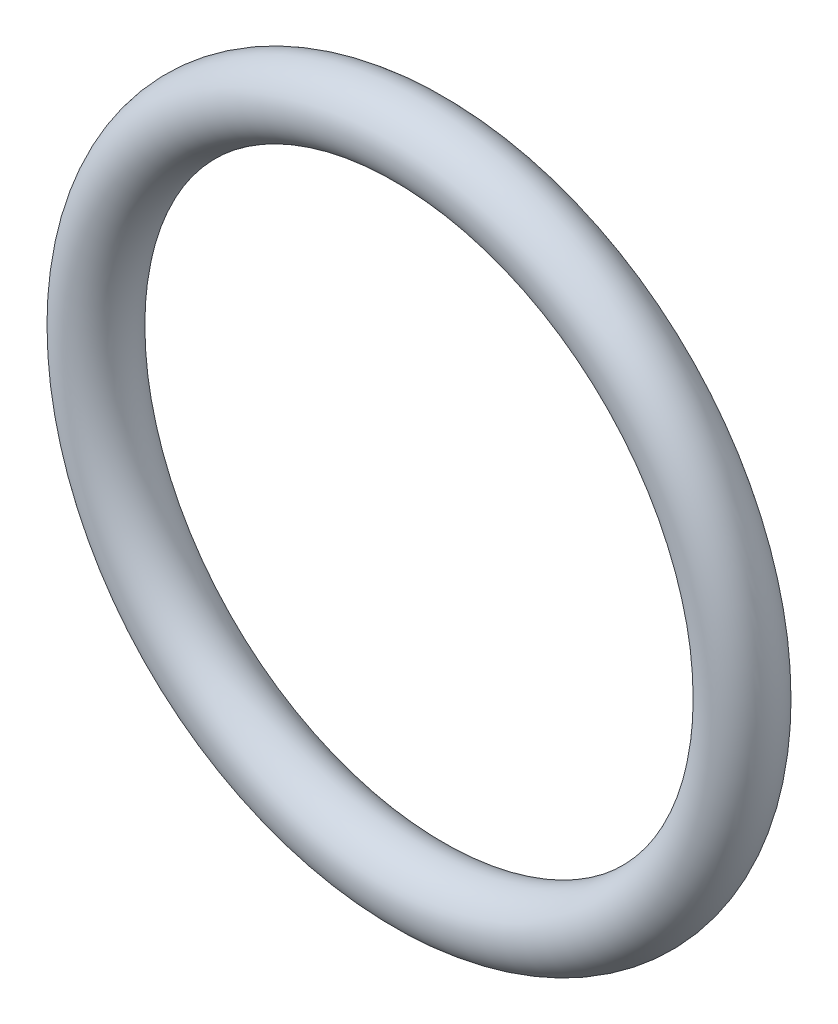
ISO-10303-21;
HEADER;
FILE_DESCRIPTION(('STEP AP214'),'2;1');
FILE_NAME('part.step','',(''),(''),'','','');
FILE_SCHEMA(('AUTOMOTIVE_DESIGN { 1 0 10303 214 1 1 1 1 }'));
ENDSEC;
DATA;
#1=APPLICATION_CONTEXT('core data for automotive mechanical design processes');
#2=APPLICATION_PROTOCOL_DEFINITION('international standard','automotive_design',2000,#1);
#3=PRODUCT_CONTEXT('',#1,'mechanical');
#4=PRODUCT('Part','Part','',(#3));
#5=PRODUCT_RELATED_PRODUCT_CATEGORY('part','',(#4));
#6=PRODUCT_DEFINITION_FORMATION('','',#4);
#7=PRODUCT_DEFINITION_CONTEXT('part definition',#1,'design');
#8=PRODUCT_DEFINITION('design','',#6,#7);
#9=PRODUCT_DEFINITION_SHAPE('','',#8);
#10=(LENGTH_UNIT() NAMED_UNIT(*) SI_UNIT(.MILLI.,.METRE.));
#11=(NAMED_UNIT(*) PLANE_ANGLE_UNIT() SI_UNIT($,.RADIAN.));
#12=(NAMED_UNIT(*) SI_UNIT($,.STERADIAN.) SOLID_ANGLE_UNIT());
#13=UNCERTAINTY_MEASURE_WITH_UNIT(LENGTH_MEASURE(1.E-05),#10,'distance_accuracy_value','');
#14=(GEOMETRIC_REPRESENTATION_CONTEXT(3) GLOBAL_UNCERTAINTY_ASSIGNED_CONTEXT((#13)) GLOBAL_UNIT_ASSIGNED_CONTEXT((#10,
#11,#12)) REPRESENTATION_CONTEXT('',''));
#15=CARTESIAN_POINT('',(0.,0.,0.));
#16=DIRECTION('',(0.,0.,1.));
#17=DIRECTION('',(1.,0.,0.));
#18=AXIS2_PLACEMENT_3D('',#15,#16,#17);
#19=CARTESIAN_POINT('',(0.,0.,0.));
#20=DIRECTION('',(0.,0.,1.));
#21=DIRECTION('',(1.,0.,0.));
#22=AXIS2_PLACEMENT_3D('',#19,#20,#21);
#23=TOROIDAL_SURFACE('',#22,14.,1.5);
#24=CARTESIAN_POINT('',(15.5,0.,0.));
#25=VERTEX_POINT('',#24);
#26=VERTEX_LOOP('',#25);
#27=FACE_BOUND('',#26,.T.);
#28=ADVANCED_FACE('F28',(#27),#23,.T.);
#29=CLOSED_SHELL('',(#28));
#30=MANIFOLD_SOLID_BREP('B2',#29);
#31=ADVANCED_BREP_SHAPE_REPRESENTATION('',(#18,#30),#14);
#32=SHAPE_DEFINITION_REPRESENTATION(#9,#31);
ENDSEC;
END-ISO-10303-21;
